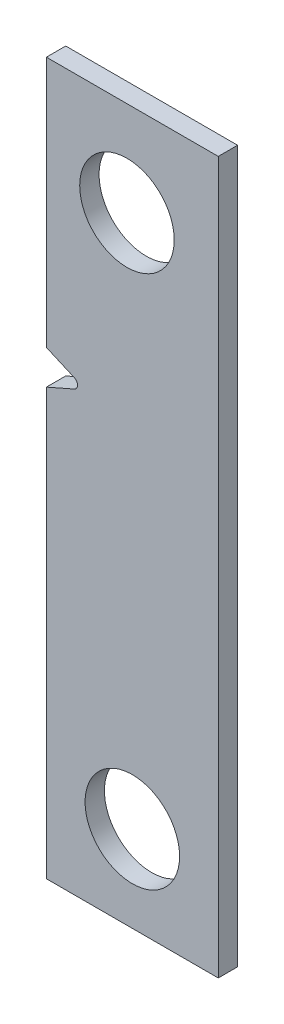
ISO-10303-21;
HEADER;
FILE_DESCRIPTION(('STEP AP214'),'2;1');
FILE_NAME('part.step','',(''),(''),'','','');
FILE_SCHEMA(('AUTOMOTIVE_DESIGN { 1 0 10303 214 1 1 1 1 }'));
ENDSEC;
DATA;
#1=APPLICATION_CONTEXT('core data for automotive mechanical design processes');
#2=APPLICATION_PROTOCOL_DEFINITION('international standard','automotive_design',2000,#1);
#3=PRODUCT_CONTEXT('',#1,'mechanical');
#4=PRODUCT('Part','Part','',(#3));
#5=PRODUCT_RELATED_PRODUCT_CATEGORY('part','',(#4));
#6=PRODUCT_DEFINITION_FORMATION('','',#4);
#7=PRODUCT_DEFINITION_CONTEXT('part definition',#1,'design');
#8=PRODUCT_DEFINITION('design','',#6,#7);
#9=PRODUCT_DEFINITION_SHAPE('','',#8);
#10=(LENGTH_UNIT() NAMED_UNIT(*) SI_UNIT(.MILLI.,.METRE.));
#11=(NAMED_UNIT(*) PLANE_ANGLE_UNIT() SI_UNIT($,.RADIAN.));
#12=(NAMED_UNIT(*) SI_UNIT($,.STERADIAN.) SOLID_ANGLE_UNIT());
#13=UNCERTAINTY_MEASURE_WITH_UNIT(LENGTH_MEASURE(1.E-05),#10,'distance_accuracy_value','');
#14=(GEOMETRIC_REPRESENTATION_CONTEXT(3) GLOBAL_UNCERTAINTY_ASSIGNED_CONTEXT((#13)) GLOBAL_UNIT_ASSIGNED_CONTEXT((#10,
#11,#12)) REPRESENTATION_CONTEXT('',''));
#15=CARTESIAN_POINT('',(0.,0.,0.));
#16=DIRECTION('',(0.,0.,1.));
#17=DIRECTION('',(1.,0.,0.));
#18=AXIS2_PLACEMENT_3D('',#15,#16,#17);
#19=CARTESIAN_POINT('',(-18.75,-20.,-7.75));
#20=DIRECTION('',(1.,0.,0.));
#21=DIRECTION('',(0.,0.,-1.));
#22=AXIS2_PLACEMENT_3D('',#19,#20,#21);
#23=PLANE('',#22);
#24=DIRECTION('',(0.,1.,0.));
#25=VECTOR('',#24,1.);
#26=CARTESIAN_POINT('',(-18.75,-20.,2.25));
#27=LINE('',#26,#25);
#28=CARTESIAN_POINT('',(-18.75,-20.,2.25));
#29=VERTEX_POINT('',#28);
#30=CARTESIAN_POINT('',(-18.75,79.0998640813626,2.25));
#31=VERTEX_POINT('',#30);
#32=EDGE_CURVE('E122',#29,#31,#27,.T.);
#33=ORIENTED_EDGE('',*,*,#32,.T.);
#34=DIRECTION('',(0.,0.,-1.));
#35=VECTOR('',#34,1.);
#36=CARTESIAN_POINT('',(-18.75,79.0998640813626,-7.75));
#37=LINE('',#36,#35);
#38=CARTESIAN_POINT('',(-18.75,79.0998640813626,-2.25));
#39=VERTEX_POINT('',#38);
#40=EDGE_CURVE('E11',#31,#39,#37,.T.);
#41=ORIENTED_EDGE('',*,*,#40,.T.);
#42=DIRECTION('',(0.,1.,0.));
#43=VECTOR('',#42,1.);
#44=CARTESIAN_POINT('',(-18.75,0.,-2.25));
#45=LINE('',#44,#43);
#46=CARTESIAN_POINT('',(-18.75,-20.,-2.25));
#47=VERTEX_POINT('',#46);
#48=EDGE_CURVE('E120',#47,#39,#45,.T.);
#49=ORIENTED_EDGE('',*,*,#48,.F.);
#50=DIRECTION('',(0.,0.,1.));
#51=VECTOR('',#50,1.);
#52=CARTESIAN_POINT('',(-18.75,-20.,-7.75));
#53=LINE('',#52,#51);
#54=EDGE_CURVE('E136',#47,#29,#53,.T.);
#55=ORIENTED_EDGE('',*,*,#54,.T.);
#56=EDGE_LOOP('',(#33,#41,#49,#55));
#57=FACE_BOUND('',#56,.T.);
#58=ADVANCED_FACE('F39',(#57),#23,.F.);
#59=CARTESIAN_POINT('',(21.25,20.,2.25));
#60=DIRECTION('',(-1.,0.,0.));
#61=DIRECTION('',(0.,0.,1.));
#62=AXIS2_PLACEMENT_3D('',#59,#60,#61);
#63=PLANE('',#62);
#64=DIRECTION('',(0.,1.,0.));
#65=VECTOR('',#64,1.);
#66=CARTESIAN_POINT('',(21.25,20.,-2.25));
#67=LINE('',#66,#65);
#68=CARTESIAN_POINT('',(21.25,-20.,-2.25));
#69=VERTEX_POINT('',#68);
#70=CARTESIAN_POINT('',(21.25,145.599864081363,-2.25));
#71=VERTEX_POINT('',#70);
#72=EDGE_CURVE('E143',#69,#71,#67,.T.);
#73=ORIENTED_EDGE('',*,*,#72,.T.);
#74=DIRECTION('',(0.,0.,-1.));
#75=VECTOR('',#74,1.);
#76=CARTESIAN_POINT('',(21.25,145.599864081363,-2.25));
#77=LINE('',#76,#75);
#78=CARTESIAN_POINT('',(21.25,145.599864081363,2.25));
#79=VERTEX_POINT('',#78);
#80=EDGE_CURVE('E173',#79,#71,#77,.T.);
#81=ORIENTED_EDGE('',*,*,#80,.F.);
#82=DIRECTION('',(0.,1.,0.));
#83=VECTOR('',#82,1.);
#84=CARTESIAN_POINT('',(21.25,20.,2.25));
#85=LINE('',#84,#83);
#86=CARTESIAN_POINT('',(21.25,-20.,2.25));
#87=VERTEX_POINT('',#86);
#88=EDGE_CURVE('E144',#87,#79,#85,.T.);
#89=ORIENTED_EDGE('',*,*,#88,.F.);
#90=DIRECTION('',(0.,0.,-1.));
#91=VECTOR('',#90,1.);
#92=CARTESIAN_POINT('',(21.25,-20.,2.25));
#93=LINE('',#92,#91);
#94=EDGE_CURVE('E149',#87,#69,#93,.T.);
#95=ORIENTED_EDGE('',*,*,#94,.T.);
#96=EDGE_LOOP('',(#73,#81,#89,#95));
#97=FACE_BOUND('',#96,.T.);
#98=ADVANCED_FACE('F41',(#97),#63,.F.);
#99=CARTESIAN_POINT('',(-21.25,-20.,2.25));
#100=DIRECTION('',(0.,1.,0.));
#101=DIRECTION('',(0.,0.,1.));
#102=AXIS2_PLACEMENT_3D('',#99,#100,#101);
#103=PLANE('',#102);
#104=DIRECTION('',(1.,0.,0.));
#105=VECTOR('',#104,1.);
#106=CARTESIAN_POINT('',(-21.25,-20.,2.25));
#107=LINE('',#106,#105);
#108=EDGE_CURVE('E64',#29,#87,#107,.T.);
#109=ORIENTED_EDGE('',*,*,#108,.F.);
#110=ORIENTED_EDGE('',*,*,#54,.F.);
#111=DIRECTION('',(1.,0.,0.));
#112=VECTOR('',#111,1.);
#113=CARTESIAN_POINT('',(-21.25,-20.,-2.25));
#114=LINE('',#113,#112);
#115=EDGE_CURVE('E126',#47,#69,#114,.T.);
#116=ORIENTED_EDGE('',*,*,#115,.T.);
#117=ORIENTED_EDGE('',*,*,#94,.F.);
#118=EDGE_LOOP('',(#109,#110,#116,#117));
#119=FACE_BOUND('',#118,.T.);
#120=ADVANCED_FACE('F217',(#119),#103,.F.);
#121=CARTESIAN_POINT('',(0.,0.,2.25));
#122=DIRECTION('',(0.,0.,1.));
#123=DIRECTION('',(1.,0.,0.));
#124=AXIS2_PLACEMENT_3D('',#121,#122,#123);
#125=PLANE('',#124);
#126=DIRECTION('',(0.915608041038949,0.4020720273593,0.));
#127=VECTOR('',#126,1.);
#128=CARTESIAN_POINT('',(-32.1510150355426,73.2150607129922,2.25));
#129=LINE('',#128,#127);
#130=CARTESIAN_POINT('',(-12.2474099658009,81.955354030064,2.25));
#131=VERTEX_POINT('',#130);
#132=EDGE_CURVE('E199',#31,#131,#129,.T.);
#133=ORIENTED_EDGE('',*,*,#132,.F.);
#134=ORIENTED_EDGE('',*,*,#32,.F.);
#135=ORIENTED_EDGE('',*,*,#108,.T.);
#136=ORIENTED_EDGE('',*,*,#88,.T.);
#137=DIRECTION('',(1.,0.,0.));
#138=VECTOR('',#137,1.);
#139=CARTESIAN_POINT('',(-18.75,145.599864081363,2.25));
#140=LINE('',#139,#138);
#141=CARTESIAN_POINT('',(-18.75,145.599864081363,2.25));
#142=VERTEX_POINT('',#141);
#143=EDGE_CURVE('E170',#142,#79,#140,.T.);
#144=ORIENTED_EDGE('',*,*,#143,.F.);
#145=CARTESIAN_POINT('',(-18.75,87.0998640813627,2.25));
#146=VERTEX_POINT('',#145);
#147=EDGE_CURVE('E162',#146,#142,#27,.T.);
#148=ORIENTED_EDGE('',*,*,#147,.F.);
#149=DIRECTION('',(-0.915608041038949,0.4020720273593,0.));
#150=VECTOR('',#149,1.);
#151=CARTESIAN_POINT('',(29.033816266728,66.1165010917509,2.25));
#152=LINE('',#151,#150);
#153=CARTESIAN_POINT('',(-12.2474099658009,84.2443741326613,2.25));
#154=VERTEX_POINT('',#153);
#155=EDGE_CURVE('E55',#154,#146,#152,.T.);
#156=ORIENTED_EDGE('',*,*,#155,.F.);
#157=CARTESIAN_POINT('',(-12.75,83.0998640813627,2.25));
#158=DIRECTION('',(0.,0.,1.));
#159=DIRECTION('',(1.,0.,0.));
#160=AXIS2_PLACEMENT_3D('',#157,#158,#159);
#161=CIRCLE('',#160,1.25);
#162=EDGE_CURVE('E196',#131,#154,#161,.T.);
#163=ORIENTED_EDGE('',*,*,#162,.F.);
#164=EDGE_LOOP('',(#133,#134,#135,#136,#144,#148,#156,#163));
#165=FACE_BOUND('',#164,.T.);
#166=CARTESIAN_POINT('',(0.,123.599864081363,2.25));
#167=DIRECTION('',(0.,0.,1.));
#168=DIRECTION('',(1.,0.,0.));
#169=AXIS2_PLACEMENT_3D('',#166,#167,#168);
#170=CIRCLE('',#169,11.);
#171=CARTESIAN_POINT('',(11.,123.599864081363,2.25));
#172=VERTEX_POINT('',#171);
#173=EDGE_CURVE('E184',#172,#172,#170,.T.);
#174=ORIENTED_EDGE('',*,*,#173,.F.);
#175=EDGE_LOOP('',(#174));
#176=FACE_BOUND('',#175,.T.);
#177=CARTESIAN_POINT('',(1.25,0.,2.25));
#178=DIRECTION('',(0.,0.,1.));
#179=DIRECTION('',(1.,0.,0.));
#180=AXIS2_PLACEMENT_3D('',#177,#178,#179);
#181=CIRCLE('',#180,11.);
#182=CARTESIAN_POINT('',(12.25,0.,2.25));
#183=VERTEX_POINT('',#182);
#184=EDGE_CURVE('E134',#183,#183,#181,.T.);
#185=ORIENTED_EDGE('',*,*,#184,.F.);
#186=EDGE_LOOP('',(#185));
#187=FACE_BOUND('',#186,.T.);
#188=ADVANCED_FACE('F166',(#165,#176,#187),#125,.T.);
#189=CARTESIAN_POINT('',(0.,0.,-2.25));
#190=DIRECTION('',(0.,0.,1.));
#191=DIRECTION('',(1.,0.,0.));
#192=AXIS2_PLACEMENT_3D('',#189,#190,#191);
#193=PLANE('',#192);
#194=CARTESIAN_POINT('',(0.,123.599864081363,-2.25));
#195=DIRECTION('',(0.,0.,-1.));
#196=DIRECTION('',(-1.,0.,0.));
#197=AXIS2_PLACEMENT_3D('',#194,#195,#196);
#198=CIRCLE('',#197,11.);
#199=CARTESIAN_POINT('',(-11.,123.599864081363,-2.25));
#200=VERTEX_POINT('',#199);
#201=EDGE_CURVE('E192',#200,#200,#198,.T.);
#202=ORIENTED_EDGE('',*,*,#201,.F.);
#203=EDGE_LOOP('',(#202));
#204=FACE_BOUND('',#203,.T.);
#205=CARTESIAN_POINT('',(1.25,0.,-2.25));
#206=DIRECTION('',(0.,0.,1.));
#207=DIRECTION('',(1.,0.,0.));
#208=AXIS2_PLACEMENT_3D('',#205,#206,#207);
#209=CIRCLE('',#208,11.);
#210=CARTESIAN_POINT('',(12.25,0.,-2.25));
#211=VERTEX_POINT('',#210);
#212=EDGE_CURVE('E128',#211,#211,#209,.T.);
#213=ORIENTED_EDGE('',*,*,#212,.T.);
#214=EDGE_LOOP('',(#213));
#215=FACE_BOUND('',#214,.T.);
#216=ORIENTED_EDGE('',*,*,#48,.T.);
#217=DIRECTION('',(-0.915608041038949,-0.4020720273593,0.));
#218=VECTOR('',#217,1.);
#219=CARTESIAN_POINT('',(-32.1510150355426,73.2150607129922,-2.25));
#220=LINE('',#219,#218);
#221=CARTESIAN_POINT('',(-12.2474099658009,81.955354030064,-2.25));
#222=VERTEX_POINT('',#221);
#223=EDGE_CURVE('E106',#222,#39,#220,.T.);
#224=ORIENTED_EDGE('',*,*,#223,.F.);
#225=CARTESIAN_POINT('',(-12.75,83.0998640813627,-2.25));
#226=DIRECTION('',(0.,0.,-1.));
#227=DIRECTION('',(-1.,0.,0.));
#228=AXIS2_PLACEMENT_3D('',#225,#226,#227);
#229=CIRCLE('',#228,1.25);
#230=CARTESIAN_POINT('',(-12.2474099658009,84.2443741326613,-2.25));
#231=VERTEX_POINT('',#230);
#232=EDGE_CURVE('E207',#231,#222,#229,.T.);
#233=ORIENTED_EDGE('',*,*,#232,.F.);
#234=DIRECTION('',(0.915608041038949,-0.4020720273593,0.));
#235=VECTOR('',#234,1.);
#236=CARTESIAN_POINT('',(29.033816266728,66.1165010917509,-2.25));
#237=LINE('',#236,#235);
#238=CARTESIAN_POINT('',(-18.75,87.0998640813627,-2.25));
#239=VERTEX_POINT('',#238);
#240=EDGE_CURVE('E116',#239,#231,#237,.T.);
#241=ORIENTED_EDGE('',*,*,#240,.F.);
#242=CARTESIAN_POINT('',(-18.75,145.599864081363,-2.25));
#243=VERTEX_POINT('',#242);
#244=EDGE_CURVE('E129',#239,#243,#45,.T.);
#245=ORIENTED_EDGE('',*,*,#244,.T.);
#246=DIRECTION('',(-1.,0.,0.));
#247=VECTOR('',#246,1.);
#248=CARTESIAN_POINT('',(-18.75,145.599864081363,-2.25));
#249=LINE('',#248,#247);
#250=EDGE_CURVE('E179',#71,#243,#249,.T.);
#251=ORIENTED_EDGE('',*,*,#250,.F.);
#252=ORIENTED_EDGE('',*,*,#72,.F.);
#253=ORIENTED_EDGE('',*,*,#115,.F.);
#254=EDGE_LOOP('',(#216,#224,#233,#241,#245,#251,#252,#253));
#255=FACE_BOUND('',#254,.T.);
#256=ADVANCED_FACE('F124',(#204,#215,#255),#193,.F.);
#257=CARTESIAN_POINT('',(1.25,0.,-2.75));
#258=DIRECTION('',(0.,0.,1.));
#259=DIRECTION('',(1.,0.,0.));
#260=AXIS2_PLACEMENT_3D('',#257,#258,#259);
#261=CYLINDRICAL_SURFACE('',#260,11.);
#262=ORIENTED_EDGE('',*,*,#184,.T.);
#263=EDGE_LOOP('',(#262));
#264=FACE_BOUND('',#263,.T.);
#265=ORIENTED_EDGE('',*,*,#212,.F.);
#266=EDGE_LOOP('',(#265));
#267=FACE_BOUND('',#266,.T.);
#268=ADVANCED_FACE('F233',(#264,#267),#261,.F.);
#269=ORIENTED_EDGE('',*,*,#244,.F.);
#270=DIRECTION('',(0.,0.,1.));
#271=VECTOR('',#270,1.);
#272=CARTESIAN_POINT('',(-18.75,87.0998640813627,-7.75));
#273=LINE('',#272,#271);
#274=EDGE_CURVE('E48',#239,#146,#273,.T.);
#275=ORIENTED_EDGE('',*,*,#274,.T.);
#276=ORIENTED_EDGE('',*,*,#147,.T.);
#277=DIRECTION('',(0.,0.,1.));
#278=VECTOR('',#277,1.);
#279=CARTESIAN_POINT('',(-18.75,145.599864081363,-2.25));
#280=LINE('',#279,#278);
#281=EDGE_CURVE('E183',#243,#142,#280,.T.);
#282=ORIENTED_EDGE('',*,*,#281,.F.);
#283=EDGE_LOOP('',(#269,#275,#276,#282));
#284=FACE_BOUND('',#283,.T.);
#285=ADVANCED_FACE('F160',(#284),#23,.F.);
#286=CARTESIAN_POINT('',(0.841754252038951,145.599864081363,-232.5));
#287=DIRECTION('',(0.,1.,0.));
#288=DIRECTION('',(0.,0.,1.));
#289=AXIS2_PLACEMENT_3D('',#286,#287,#288);
#290=PLANE('',#289);
#291=ORIENTED_EDGE('',*,*,#250,.T.);
#292=ORIENTED_EDGE('',*,*,#281,.T.);
#293=ORIENTED_EDGE('',*,*,#143,.T.);
#294=ORIENTED_EDGE('',*,*,#80,.T.);
#295=EDGE_LOOP('',(#291,#292,#293,#294));
#296=FACE_BOUND('',#295,.T.);
#297=ADVANCED_FACE('F223',(#296),#290,.T.);
#298=CARTESIAN_POINT('',(0.,123.599864081363,97.75));
#299=DIRECTION('',(0.,0.,-1.));
#300=DIRECTION('',(-1.,0.,0.));
#301=AXIS2_PLACEMENT_3D('',#298,#299,#300);
#302=CYLINDRICAL_SURFACE('',#301,11.);
#303=ORIENTED_EDGE('',*,*,#173,.T.);
#304=EDGE_LOOP('',(#303));
#305=FACE_BOUND('',#304,.T.);
#306=ORIENTED_EDGE('',*,*,#201,.T.);
#307=EDGE_LOOP('',(#306));
#308=FACE_BOUND('',#307,.T.);
#309=ADVANCED_FACE('F225',(#305,#308),#302,.F.);
#310=CARTESIAN_POINT('',(-32.1510150355426,73.2150607129922,97.75));
#311=DIRECTION('',(0.4020720273593,-0.915608041038949,0.));
#312=DIRECTION('',(0.915608041038949,0.4020720273593,0.));
#313=AXIS2_PLACEMENT_3D('',#310,#311,#312);
#314=PLANE('',#313);
#315=ORIENTED_EDGE('',*,*,#132,.T.);
#316=DIRECTION('',(0.,0.,-1.));
#317=VECTOR('',#316,1.);
#318=CARTESIAN_POINT('',(-12.2474099658009,81.955354030064,97.75));
#319=LINE('',#318,#317);
#320=EDGE_CURVE('E110',#131,#222,#319,.T.);
#321=ORIENTED_EDGE('',*,*,#320,.T.);
#322=ORIENTED_EDGE('',*,*,#223,.T.);
#323=ORIENTED_EDGE('',*,*,#40,.F.);
#324=EDGE_LOOP('',(#315,#321,#322,#323));
#325=FACE_BOUND('',#324,.T.);
#326=ADVANCED_FACE('F107',(#325),#314,.F.);
#327=CARTESIAN_POINT('',(-12.75,83.0998640813627,97.75));
#328=DIRECTION('',(0.,0.,-1.));
#329=DIRECTION('',(-1.,0.,0.));
#330=AXIS2_PLACEMENT_3D('',#327,#328,#329);
#331=CYLINDRICAL_SURFACE('',#330,1.25);
#332=ORIENTED_EDGE('',*,*,#162,.T.);
#333=DIRECTION('',(0.,0.,-1.));
#334=VECTOR('',#333,1.);
#335=CARTESIAN_POINT('',(-12.2474099658009,84.2443741326613,97.75));
#336=LINE('',#335,#334);
#337=EDGE_CURVE('E204',#154,#231,#336,.T.);
#338=ORIENTED_EDGE('',*,*,#337,.T.);
#339=ORIENTED_EDGE('',*,*,#232,.T.);
#340=ORIENTED_EDGE('',*,*,#320,.F.);
#341=EDGE_LOOP('',(#332,#338,#339,#340));
#342=FACE_BOUND('',#341,.T.);
#343=ADVANCED_FACE('F215',(#342),#331,.F.);
#344=CARTESIAN_POINT('',(29.033816266728,66.1165010917509,97.75));
#345=DIRECTION('',(0.4020720273593,0.915608041038949,0.));
#346=DIRECTION('',(-0.915608041038949,0.4020720273593,0.));
#347=AXIS2_PLACEMENT_3D('',#344,#345,#346);
#348=PLANE('',#347);
#349=ORIENTED_EDGE('',*,*,#155,.T.);
#350=ORIENTED_EDGE('',*,*,#274,.F.);
#351=ORIENTED_EDGE('',*,*,#240,.T.);
#352=ORIENTED_EDGE('',*,*,#337,.F.);
#353=EDGE_LOOP('',(#349,#350,#351,#352));
#354=FACE_BOUND('',#353,.T.);
#355=ADVANCED_FACE('F213',(#354),#348,.F.);
#356=CLOSED_SHELL('',(#58,#98,#120,#188,#256,#268,#285,#297,#309,#326,#343,#355));
#357=MANIFOLD_SOLID_BREP('B2',#356);
#358=ADVANCED_BREP_SHAPE_REPRESENTATION('',(#18,#357),#14);
#359=SHAPE_DEFINITION_REPRESENTATION(#9,#358);
ENDSEC;
END-ISO-10303-21;
